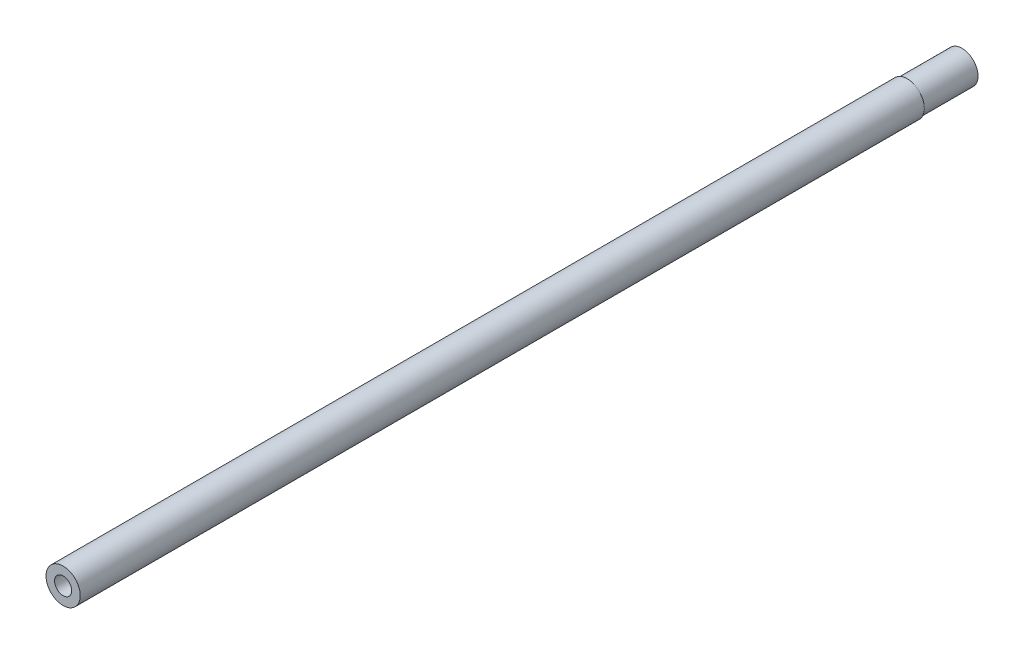
ISO-10303-21;
HEADER;
FILE_DESCRIPTION(('STEP AP214'),'2;1');
FILE_NAME('part.step','',(''),(''),'','','');
FILE_SCHEMA(('AUTOMOTIVE_DESIGN { 1 0 10303 214 1 1 1 1 }'));
ENDSEC;
DATA;
#1=APPLICATION_CONTEXT('core data for automotive mechanical design processes');
#2=APPLICATION_PROTOCOL_DEFINITION('international standard','automotive_design',2000,#1);
#3=PRODUCT_CONTEXT('',#1,'mechanical');
#4=PRODUCT('Part','Part','',(#3));
#5=PRODUCT_RELATED_PRODUCT_CATEGORY('part','',(#4));
#6=PRODUCT_DEFINITION_FORMATION('','',#4);
#7=PRODUCT_DEFINITION_CONTEXT('part definition',#1,'design');
#8=PRODUCT_DEFINITION('design','',#6,#7);
#9=PRODUCT_DEFINITION_SHAPE('','',#8);
#10=(LENGTH_UNIT() NAMED_UNIT(*) SI_UNIT(.MILLI.,.METRE.));
#11=(NAMED_UNIT(*) PLANE_ANGLE_UNIT() SI_UNIT($,.RADIAN.));
#12=(NAMED_UNIT(*) SI_UNIT($,.STERADIAN.) SOLID_ANGLE_UNIT());
#13=UNCERTAINTY_MEASURE_WITH_UNIT(LENGTH_MEASURE(1.E-05),#10,'distance_accuracy_value','');
#14=(GEOMETRIC_REPRESENTATION_CONTEXT(3) GLOBAL_UNCERTAINTY_ASSIGNED_CONTEXT((#13)) GLOBAL_UNIT_ASSIGNED_CONTEXT((#10,
#11,#12)) REPRESENTATION_CONTEXT('',''));
#15=CARTESIAN_POINT('',(0.,0.,0.));
#16=DIRECTION('',(0.,0.,1.));
#17=DIRECTION('',(1.,0.,0.));
#18=AXIS2_PLACEMENT_3D('',#15,#16,#17);
#19=CARTESIAN_POINT('',(0.,0.,0.));
#20=DIRECTION('',(0.,0.,1.));
#21=DIRECTION('',(1.,0.,0.));
#22=AXIS2_PLACEMENT_3D('',#19,#20,#21);
#23=PLANE('',#22);
#24=CARTESIAN_POINT('',(0.,0.,0.));
#25=DIRECTION('',(0.,0.,1.));
#26=DIRECTION('',(1.,0.,0.));
#27=AXIS2_PLACEMENT_3D('',#24,#25,#26);
#28=CIRCLE('',#27,20.);
#29=CARTESIAN_POINT('',(20.,0.,0.));
#30=VERTEX_POINT('',#29);
#31=EDGE_CURVE('E44',#30,#30,#28,.T.);
#32=ORIENTED_EDGE('',*,*,#31,.T.);
#33=EDGE_LOOP('',(#32));
#34=FACE_BOUND('',#33,.T.);
#35=CARTESIAN_POINT('',(0.,0.,0.));
#36=DIRECTION('',(0.,0.,-1.));
#37=DIRECTION('',(-1.,0.,0.));
#38=AXIS2_PLACEMENT_3D('',#35,#36,#37);
#39=CIRCLE('',#38,37.5);
#40=CARTESIAN_POINT('',(-37.5,0.,0.));
#41=VERTEX_POINT('',#40);
#42=EDGE_CURVE('E54',#41,#41,#39,.T.);
#43=ORIENTED_EDGE('',*,*,#42,.T.);
#44=EDGE_LOOP('',(#43));
#45=FACE_BOUND('',#44,.T.);
#46=ADVANCED_FACE('F33',(#34,#45),#23,.F.);
#47=CARTESIAN_POINT('',(0.,0.,2100.));
#48=DIRECTION('',(0.,0.,-1.));
#49=DIRECTION('',(-1.,0.,0.));
#50=AXIS2_PLACEMENT_3D('',#47,#48,#49);
#51=CYLINDRICAL_SURFACE('',#50,40.);
#52=CARTESIAN_POINT('',(0.,0.,2100.));
#53=DIRECTION('',(0.,0.,1.));
#54=DIRECTION('',(1.,0.,0.));
#55=AXIS2_PLACEMENT_3D('',#52,#53,#54);
#56=CIRCLE('',#55,40.);
#57=CARTESIAN_POINT('',(40.,0.,2100.));
#58=VERTEX_POINT('',#57);
#59=EDGE_CURVE('E10',#58,#58,#56,.T.);
#60=ORIENTED_EDGE('',*,*,#59,.F.);
#61=EDGE_LOOP('',(#60));
#62=FACE_BOUND('',#61,.T.);
#63=CARTESIAN_POINT('',(0.,0.,128.));
#64=DIRECTION('',(0.,0.,-1.));
#65=DIRECTION('',(-1.,0.,0.));
#66=AXIS2_PLACEMENT_3D('',#63,#64,#65);
#67=CIRCLE('',#66,40.);
#68=CARTESIAN_POINT('',(-40.,0.,128.));
#69=VERTEX_POINT('',#68);
#70=EDGE_CURVE('E49',#69,#69,#67,.T.);
#71=ORIENTED_EDGE('',*,*,#70,.F.);
#72=EDGE_LOOP('',(#71));
#73=FACE_BOUND('',#72,.T.);
#74=ADVANCED_FACE('F35',(#62,#73),#51,.T.);
#75=CARTESIAN_POINT('',(0.,0.,2100.));
#76=DIRECTION('',(0.,0.,1.));
#77=DIRECTION('',(1.,0.,0.));
#78=AXIS2_PLACEMENT_3D('',#75,#76,#77);
#79=PLANE('',#78);
#80=ORIENTED_EDGE('',*,*,#59,.T.);
#81=EDGE_LOOP('',(#80));
#82=FACE_BOUND('',#81,.T.);
#83=CARTESIAN_POINT('',(0.,0.,2100.));
#84=DIRECTION('',(0.,0.,1.));
#85=DIRECTION('',(1.,0.,0.));
#86=AXIS2_PLACEMENT_3D('',#83,#84,#85);
#87=CIRCLE('',#86,20.);
#88=CARTESIAN_POINT('',(20.,0.,2100.));
#89=VERTEX_POINT('',#88);
#90=EDGE_CURVE('E40',#89,#89,#87,.T.);
#91=ORIENTED_EDGE('',*,*,#90,.F.);
#92=EDGE_LOOP('',(#91));
#93=FACE_BOUND('',#92,.T.);
#94=ADVANCED_FACE('F71',(#82,#93),#79,.T.);
#95=CARTESIAN_POINT('',(0.,0.,2100.));
#96=DIRECTION('',(0.,0.,-1.));
#97=DIRECTION('',(-1.,0.,0.));
#98=AXIS2_PLACEMENT_3D('',#95,#96,#97);
#99=CYLINDRICAL_SURFACE('',#98,20.);
#100=ORIENTED_EDGE('',*,*,#90,.T.);
#101=EDGE_LOOP('',(#100));
#102=FACE_BOUND('',#101,.T.);
#103=ORIENTED_EDGE('',*,*,#31,.F.);
#104=EDGE_LOOP('',(#103));
#105=FACE_BOUND('',#104,.T.);
#106=ADVANCED_FACE('F66',(#102,#105),#99,.F.);
#107=CARTESIAN_POINT('',(0.,0.,128.));
#108=DIRECTION('',(0.,0.,-1.));
#109=DIRECTION('',(-1.,0.,0.));
#110=AXIS2_PLACEMENT_3D('',#107,#108,#109);
#111=PLANE('',#110);
#112=CARTESIAN_POINT('',(0.,0.,128.));
#113=DIRECTION('',(0.,0.,-1.));
#114=DIRECTION('',(-1.,0.,0.));
#115=AXIS2_PLACEMENT_3D('',#112,#113,#114);
#116=CIRCLE('',#115,37.5);
#117=CARTESIAN_POINT('',(-37.5,0.,128.));
#118=VERTEX_POINT('',#117);
#119=EDGE_CURVE('E53',#118,#118,#116,.T.);
#120=ORIENTED_EDGE('',*,*,#119,.F.);
#121=EDGE_LOOP('',(#120));
#122=FACE_BOUND('',#121,.T.);
#123=ORIENTED_EDGE('',*,*,#70,.T.);
#124=EDGE_LOOP('',(#123));
#125=FACE_BOUND('',#124,.T.);
#126=ADVANCED_FACE('F63',(#122,#125),#111,.T.);
#127=CARTESIAN_POINT('',(0.,0.,128.));
#128=DIRECTION('',(0.,0.,-1.));
#129=DIRECTION('',(-1.,0.,0.));
#130=AXIS2_PLACEMENT_3D('',#127,#128,#129);
#131=CYLINDRICAL_SURFACE('',#130,37.5);
#132=ORIENTED_EDGE('',*,*,#119,.T.);
#133=EDGE_LOOP('',(#132));
#134=FACE_BOUND('',#133,.T.);
#135=ORIENTED_EDGE('',*,*,#42,.F.);
#136=EDGE_LOOP('',(#135));
#137=FACE_BOUND('',#136,.T.);
#138=ADVANCED_FACE('F60',(#134,#137),#131,.T.);
#139=CLOSED_SHELL('',(#46,#74,#94,#106,#126,#138));
#140=MANIFOLD_SOLID_BREP('B2',#139);
#141=ADVANCED_BREP_SHAPE_REPRESENTATION('',(#18,#140),#14);
#142=SHAPE_DEFINITION_REPRESENTATION(#9,#141);
ENDSEC;
END-ISO-10303-21;
